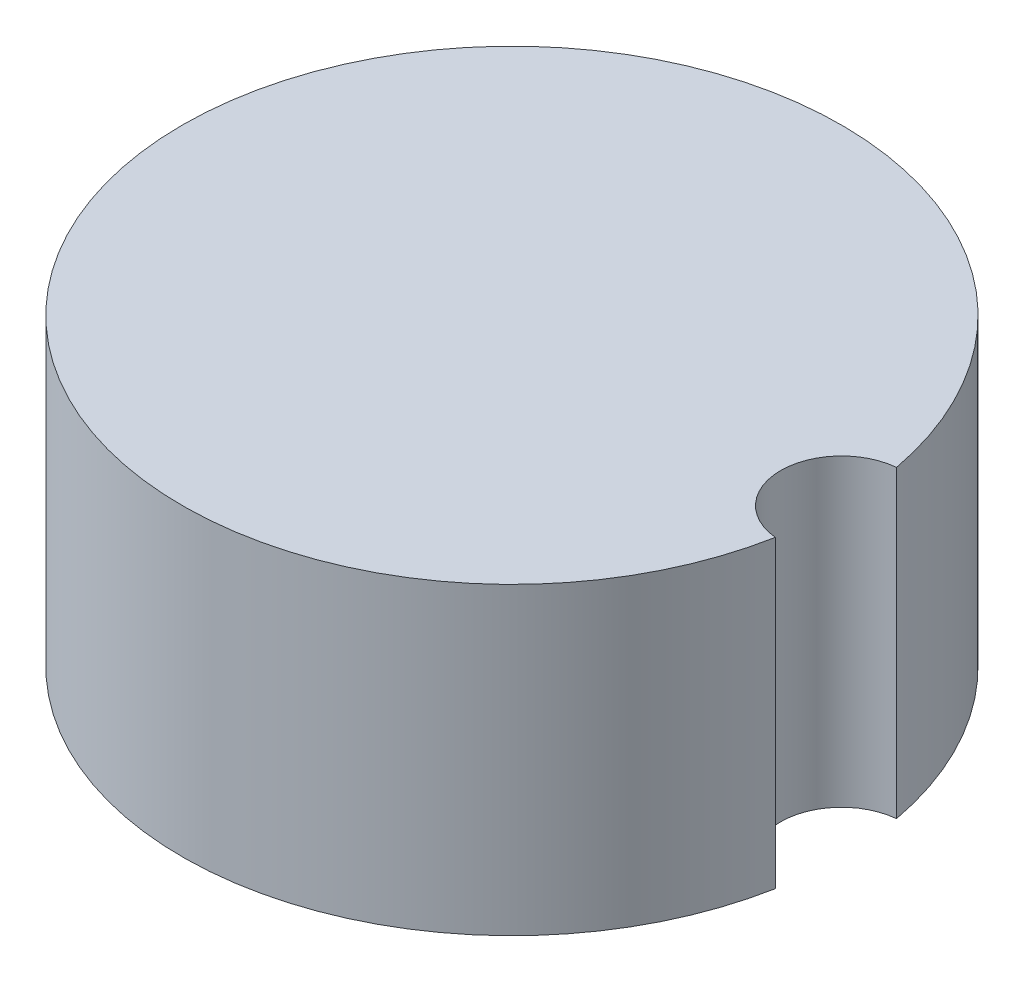
ISO-10303-21;
HEADER;
FILE_DESCRIPTION(('STEP AP214'),'2;1');
FILE_NAME('part.step','',(''),(''),'','','');
FILE_SCHEMA(('AUTOMOTIVE_DESIGN { 1 0 10303 214 1 1 1 1 }'));
ENDSEC;
DATA;
#1=APPLICATION_CONTEXT('core data for automotive mechanical design processes');
#2=APPLICATION_PROTOCOL_DEFINITION('international standard','automotive_design',2000,#1);
#3=PRODUCT_CONTEXT('',#1,'mechanical');
#4=PRODUCT('Part','Part','',(#3));
#5=PRODUCT_RELATED_PRODUCT_CATEGORY('part','',(#4));
#6=PRODUCT_DEFINITION_FORMATION('','',#4);
#7=PRODUCT_DEFINITION_CONTEXT('part definition',#1,'design');
#8=PRODUCT_DEFINITION('design','',#6,#7);
#9=PRODUCT_DEFINITION_SHAPE('','',#8);
#10=(LENGTH_UNIT() NAMED_UNIT(*) SI_UNIT(.MILLI.,.METRE.));
#11=(NAMED_UNIT(*) PLANE_ANGLE_UNIT() SI_UNIT($,.RADIAN.));
#12=(NAMED_UNIT(*) SI_UNIT($,.STERADIAN.) SOLID_ANGLE_UNIT());
#13=UNCERTAINTY_MEASURE_WITH_UNIT(LENGTH_MEASURE(1.E-05),#10,'distance_accuracy_value','');
#14=(GEOMETRIC_REPRESENTATION_CONTEXT(3) GLOBAL_UNCERTAINTY_ASSIGNED_CONTEXT((#13)) GLOBAL_UNIT_ASSIGNED_CONTEXT((#10,
#11,#12)) REPRESENTATION_CONTEXT('',''));
#15=CARTESIAN_POINT('',(0.,0.,0.));
#16=DIRECTION('',(0.,0.,1.));
#17=DIRECTION('',(1.,0.,0.));
#18=AXIS2_PLACEMENT_3D('',#15,#16,#17);
#19=CARTESIAN_POINT('',(0.,81.,0.));
#20=DIRECTION('',(0.,-1.,0.));
#21=DIRECTION('',(0.,0.,-1.));
#22=AXIS2_PLACEMENT_3D('',#19,#20,#21);
#23=CYLINDRICAL_SURFACE('',#22,6.5);
#24=CARTESIAN_POINT('',(0.,75.,0.));
#25=DIRECTION('',(0.,1.,0.));
#26=DIRECTION('',(0.,0.,1.));
#27=AXIS2_PLACEMENT_3D('',#24,#25,#26);
#28=CIRCLE('',#27,6.5);
#29=CARTESIAN_POINT('',(6.38923076923077,75.,-1.19487663694408));
#30=VERTEX_POINT('',#29);
#31=CARTESIAN_POINT('',(6.38923076923077,75.,1.19487663694408));
#32=VERTEX_POINT('',#31);
#33=EDGE_CURVE('E64',#30,#32,#28,.T.);
#34=ORIENTED_EDGE('',*,*,#33,.T.);
#35=DIRECTION('',(0.,-1.,0.));
#36=VECTOR('',#35,1.);
#37=CARTESIAN_POINT('',(6.38923076923077,81.,1.19487663694408));
#38=LINE('',#37,#36);
#39=CARTESIAN_POINT('',(6.38923076923077,81.,1.19487663694408));
#40=VERTEX_POINT('',#39);
#41=EDGE_CURVE('E11',#40,#32,#38,.T.);
#42=ORIENTED_EDGE('',*,*,#41,.F.);
#43=CARTESIAN_POINT('',(0.,81.,0.));
#44=DIRECTION('',(0.,1.,0.));
#45=DIRECTION('',(0.,0.,1.));
#46=AXIS2_PLACEMENT_3D('',#43,#44,#45);
#47=CIRCLE('',#46,6.5);
#48=CARTESIAN_POINT('',(6.38923076923077,81.,-1.19487663694408));
#49=VERTEX_POINT('',#48);
#50=EDGE_CURVE('E63',#49,#40,#47,.T.);
#51=ORIENTED_EDGE('',*,*,#50,.F.);
#52=DIRECTION('',(0.,-1.,0.));
#53=VECTOR('',#52,1.);
#54=CARTESIAN_POINT('',(6.38923076923077,81.,-1.19487663694408));
#55=LINE('',#54,#53);
#56=EDGE_CURVE('E41',#49,#30,#55,.T.);
#57=ORIENTED_EDGE('',*,*,#56,.T.);
#58=EDGE_LOOP('',(#34,#42,#51,#57));
#59=FACE_BOUND('',#58,.T.);
#60=ADVANCED_FACE('F33',(#59),#23,.T.);
#61=CARTESIAN_POINT('',(6.5,81.,0.));
#62=DIRECTION('',(0.,-1.,0.));
#63=DIRECTION('',(0.,0.,-1.));
#64=AXIS2_PLACEMENT_3D('',#61,#62,#63);
#65=CYLINDRICAL_SURFACE('',#64,1.2);
#66=CARTESIAN_POINT('',(6.5,75.,0.));
#67=DIRECTION('',(0.,-1.,0.));
#68=DIRECTION('',(0.,0.,1.));
#69=AXIS2_PLACEMENT_3D('',#66,#67,#68);
#70=CIRCLE('',#69,1.2);
#71=EDGE_CURVE('E56',#32,#30,#70,.T.);
#72=ORIENTED_EDGE('',*,*,#71,.T.);
#73=ORIENTED_EDGE('',*,*,#56,.F.);
#74=CARTESIAN_POINT('',(6.5,81.,0.));
#75=DIRECTION('',(0.,-1.,0.));
#76=DIRECTION('',(0.,0.,1.));
#77=AXIS2_PLACEMENT_3D('',#74,#75,#76);
#78=CIRCLE('',#77,1.2);
#79=EDGE_CURVE('E48',#40,#49,#78,.T.);
#80=ORIENTED_EDGE('',*,*,#79,.F.);
#81=ORIENTED_EDGE('',*,*,#41,.T.);
#82=EDGE_LOOP('',(#72,#73,#80,#81));
#83=FACE_BOUND('',#82,.T.);
#84=ADVANCED_FACE('F59',(#83),#65,.F.);
#85=CARTESIAN_POINT('',(3.25,81.,0.));
#86=DIRECTION('',(0.,1.,0.));
#87=DIRECTION('',(0.,0.,1.));
#88=AXIS2_PLACEMENT_3D('',#85,#86,#87);
#89=PLANE('',#88);
#90=ORIENTED_EDGE('',*,*,#50,.T.);
#91=ORIENTED_EDGE('',*,*,#79,.T.);
#92=EDGE_LOOP('',(#90,#91));
#93=FACE_BOUND('',#92,.T.);
#94=ADVANCED_FACE('F71',(#93),#89,.T.);
#95=CARTESIAN_POINT('',(3.25,75.,0.));
#96=DIRECTION('',(0.,1.,0.));
#97=DIRECTION('',(0.,0.,1.));
#98=AXIS2_PLACEMENT_3D('',#95,#96,#97);
#99=PLANE('',#98);
#100=ORIENTED_EDGE('',*,*,#33,.F.);
#101=ORIENTED_EDGE('',*,*,#71,.F.);
#102=EDGE_LOOP('',(#100,#101));
#103=FACE_BOUND('',#102,.T.);
#104=ADVANCED_FACE('F67',(#103),#99,.F.);
#105=CLOSED_SHELL('',(#60,#84,#94,#104));
#106=MANIFOLD_SOLID_BREP('B2',#105);
#107=ADVANCED_BREP_SHAPE_REPRESENTATION('',(#18,#106),#14);
#108=SHAPE_DEFINITION_REPRESENTATION(#9,#107);
ENDSEC;
END-ISO-10303-21;
